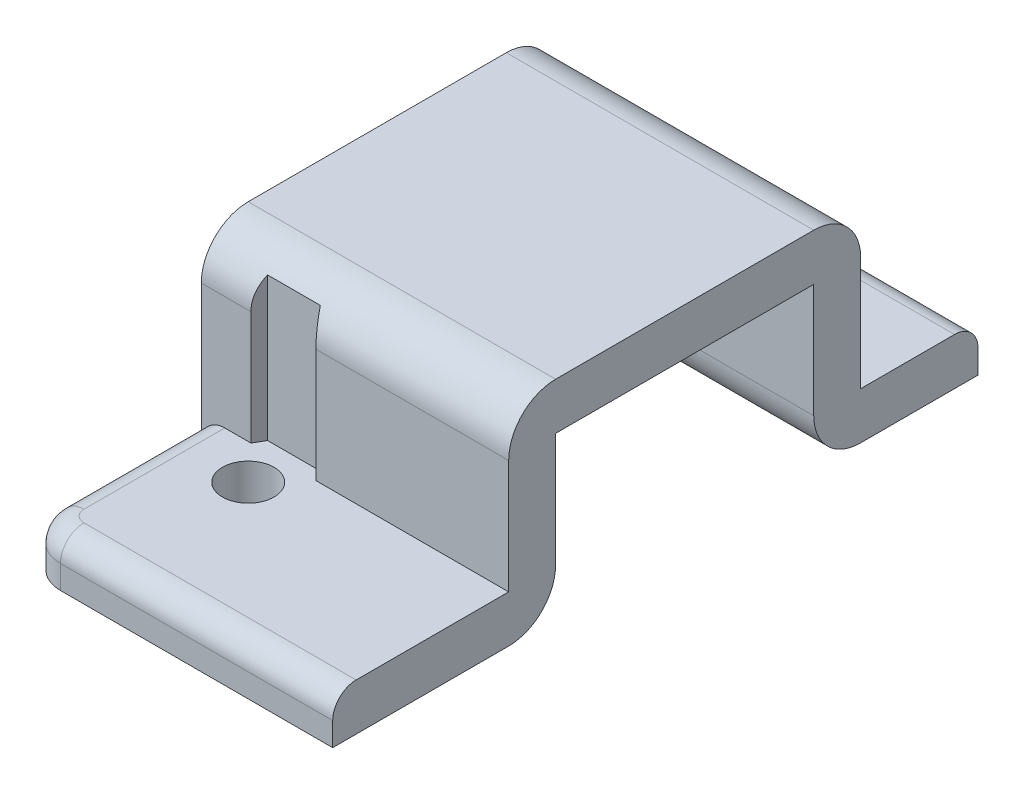
ISO-10303-21;
HEADER;
FILE_DESCRIPTION(('STEP AP214'),'2;1');
FILE_NAME('part.step','',(''),(''),'','','');
FILE_SCHEMA(('AUTOMOTIVE_DESIGN { 1 0 10303 214 1 1 1 1 }'));
ENDSEC;
DATA;
#1=APPLICATION_CONTEXT('core data for automotive mechanical design processes');
#2=APPLICATION_PROTOCOL_DEFINITION('international standard','automotive_design',2000,#1);
#3=PRODUCT_CONTEXT('',#1,'mechanical');
#4=PRODUCT('Part','Part','',(#3));
#5=PRODUCT_RELATED_PRODUCT_CATEGORY('part','',(#4));
#6=PRODUCT_DEFINITION_FORMATION('','',#4);
#7=PRODUCT_DEFINITION_CONTEXT('part definition',#1,'design');
#8=PRODUCT_DEFINITION('design','',#6,#7);
#9=PRODUCT_DEFINITION_SHAPE('','',#8);
#10=(LENGTH_UNIT() NAMED_UNIT(*) SI_UNIT(.MILLI.,.METRE.));
#11=(NAMED_UNIT(*) PLANE_ANGLE_UNIT() SI_UNIT($,.RADIAN.));
#12=(NAMED_UNIT(*) SI_UNIT($,.STERADIAN.) SOLID_ANGLE_UNIT());
#13=UNCERTAINTY_MEASURE_WITH_UNIT(LENGTH_MEASURE(1.E-05),#10,'distance_accuracy_value','');
#14=(GEOMETRIC_REPRESENTATION_CONTEXT(3) GLOBAL_UNCERTAINTY_ASSIGNED_CONTEXT((#13)) GLOBAL_UNIT_ASSIGNED_CONTEXT((#10,
#11,#12)) REPRESENTATION_CONTEXT('',''));
#15=CARTESIAN_POINT('',(0.,0.,0.));
#16=DIRECTION('',(0.,0.,1.));
#17=DIRECTION('',(1.,0.,0.));
#18=AXIS2_PLACEMENT_3D('',#15,#16,#17);
#19=CARTESIAN_POINT('',(6.55,0.,-7.5));
#20=DIRECTION('',(0.,0.,1.));
#21=DIRECTION('',(0.,-1.,0.));
#22=AXIS2_PLACEMENT_3D('',#19,#20,#21);
#23=PLANE('',#22);
#24=DIRECTION('',(0.,1.,0.));
#25=VECTOR('',#24,1.);
#26=CARTESIAN_POINT('',(-6.55,0.,-7.5));
#27=LINE('',#26,#25);
#28=CARTESIAN_POINT('',(-6.55,1.,-7.5));
#29=VERTEX_POINT('',#28);
#30=CARTESIAN_POINT('',(-6.55,6.85,-7.5));
#31=VERTEX_POINT('',#30);
#32=EDGE_CURVE('E427',#29,#31,#27,.T.);
#33=ORIENTED_EDGE('',*,*,#32,.T.);
#34=DIRECTION('',(1.,0.,0.));
#35=VECTOR('',#34,1.);
#36=CARTESIAN_POINT('',(-5.49198729810778,6.85,-7.5));
#37=LINE('',#36,#35);
#38=CARTESIAN_POINT('',(-4.43397459621556,6.85,-7.5));
#39=VERTEX_POINT('',#38);
#40=EDGE_CURVE('E259',#31,#39,#37,.T.);
#41=ORIENTED_EDGE('',*,*,#40,.T.);
#42=DIRECTION('',(0.,1.,0.));
#43=VECTOR('',#42,1.);
#44=CARTESIAN_POINT('',(-4.43397459621556,8.851,-7.5));
#45=LINE('',#44,#43);
#46=CARTESIAN_POINT('',(-4.43397459621556,2.,-7.5));
#47=VERTEX_POINT('',#46);
#48=EDGE_CURVE('E243',#47,#39,#45,.T.);
#49=ORIENTED_EDGE('',*,*,#48,.F.);
#50=DIRECTION('',(-1.,0.,0.));
#51=VECTOR('',#50,1.);
#52=CARTESIAN_POINT('',(6.55,2.,-7.5));
#53=LINE('',#52,#51);
#54=CARTESIAN_POINT('',(-5.55,2.,-7.5));
#55=VERTEX_POINT('',#54);
#56=EDGE_CURVE('E256',#47,#55,#53,.T.);
#57=ORIENTED_EDGE('',*,*,#56,.T.);
#58=CARTESIAN_POINT('',(-5.55,1.,-7.5));
#59=DIRECTION('',(0.,0.,1.));
#60=DIRECTION('',(0.,-1.,0.));
#61=AXIS2_PLACEMENT_3D('',#58,#59,#60);
#62=CIRCLE('',#61,1.);
#63=EDGE_CURVE('E11',#55,#29,#62,.T.);
#64=ORIENTED_EDGE('',*,*,#63,.T.);
#65=EDGE_LOOP('',(#33,#41,#49,#57,#64));
#66=FACE_BOUND('',#65,.T.);
#67=ADVANCED_FACE('F38',(#66),#23,.F.);
#68=CARTESIAN_POINT('',(6.55,8.85,0.));
#69=DIRECTION('',(0.,1.,0.));
#70=DIRECTION('',(0.,0.,1.));
#71=AXIS2_PLACEMENT_3D('',#68,#69,#70);
#72=PLANE('',#71);
#73=DIRECTION('',(0.,0.,-1.));
#74=VECTOR('',#73,1.);
#75=CARTESIAN_POINT('',(-6.55,8.85,0.));
#76=LINE('',#75,#74);
#77=CARTESIAN_POINT('',(-6.55,8.85,5.5));
#78=VERTEX_POINT('',#77);
#79=CARTESIAN_POINT('',(-6.55,8.85,-5.5));
#80=VERTEX_POINT('',#79);
#81=EDGE_CURVE('E429',#78,#80,#76,.T.);
#82=ORIENTED_EDGE('',*,*,#81,.F.);
#83=DIRECTION('',(-1.,0.,0.));
#84=VECTOR('',#83,1.);
#85=CARTESIAN_POINT('',(6.55,8.85,5.5));
#86=LINE('',#85,#84);
#87=CARTESIAN_POINT('',(6.55,8.85,5.5));
#88=VERTEX_POINT('',#87);
#89=EDGE_CURVE('E314',#78,#88,#86,.F.);
#90=ORIENTED_EDGE('',*,*,#89,.T.);
#91=DIRECTION('',(0.,0.,-1.));
#92=VECTOR('',#91,1.);
#93=CARTESIAN_POINT('',(6.55,8.85,0.));
#94=LINE('',#93,#92);
#95=CARTESIAN_POINT('',(6.55,8.85,-5.5));
#96=VERTEX_POINT('',#95);
#97=EDGE_CURVE('E396',#88,#96,#94,.T.);
#98=ORIENTED_EDGE('',*,*,#97,.T.);
#99=DIRECTION('',(-1.,0.,0.));
#100=VECTOR('',#99,1.);
#101=CARTESIAN_POINT('',(-1.66602540378444,8.85,-5.5));
#102=LINE('',#101,#100);
#103=EDGE_CURVE('E311',#96,#80,#102,.T.);
#104=ORIENTED_EDGE('',*,*,#103,.T.);
#105=EDGE_LOOP('',(#82,#90,#98,#104));
#106=FACE_BOUND('',#105,.T.);
#107=ADVANCED_FACE('F586',(#106),#72,.T.);
#108=CARTESIAN_POINT('',(6.55,0.,7.5));
#109=DIRECTION('',(0.,0.,1.));
#110=DIRECTION('',(0.,-1.,0.));
#111=AXIS2_PLACEMENT_3D('',#108,#109,#110);
#112=PLANE('',#111);
#113=DIRECTION('',(0.,-1.,0.));
#114=VECTOR('',#113,1.);
#115=CARTESIAN_POINT('',(-4.43397459621556,8.851,7.5));
#116=LINE('',#115,#114);
#117=CARTESIAN_POINT('',(-4.43397459621556,6.85,7.5));
#118=VERTEX_POINT('',#117);
#119=CARTESIAN_POINT('',(-4.43397459621556,2.,7.5));
#120=VERTEX_POINT('',#119);
#121=EDGE_CURVE('E554',#118,#120,#116,.T.);
#122=ORIENTED_EDGE('',*,*,#121,.F.);
#123=DIRECTION('',(-1.,0.,0.));
#124=VECTOR('',#123,1.);
#125=CARTESIAN_POINT('',(-5.49198729810778,6.85,7.5));
#126=LINE('',#125,#124);
#127=CARTESIAN_POINT('',(-6.55,6.85,7.5));
#128=VERTEX_POINT('',#127);
#129=EDGE_CURVE('E309',#118,#128,#126,.T.);
#130=ORIENTED_EDGE('',*,*,#129,.T.);
#131=DIRECTION('',(0.,1.,0.));
#132=VECTOR('',#131,1.);
#133=CARTESIAN_POINT('',(-6.55,0.,7.5));
#134=LINE('',#133,#132);
#135=CARTESIAN_POINT('',(-6.55,1.,7.5));
#136=VERTEX_POINT('',#135);
#137=EDGE_CURVE('E433',#136,#128,#134,.T.);
#138=ORIENTED_EDGE('',*,*,#137,.F.);
#139=CARTESIAN_POINT('',(-5.55,1.,7.5));
#140=DIRECTION('',(0.,0.,1.));
#141=DIRECTION('',(0.,-1.,0.));
#142=AXIS2_PLACEMENT_3D('',#139,#140,#141);
#143=CIRCLE('',#142,1.);
#144=CARTESIAN_POINT('',(-5.55,2.,7.5));
#145=VERTEX_POINT('',#144);
#146=EDGE_CURVE('E47',#136,#145,#143,.F.);
#147=ORIENTED_EDGE('',*,*,#146,.T.);
#148=DIRECTION('',(-1.,0.,0.));
#149=VECTOR('',#148,1.);
#150=CARTESIAN_POINT('',(6.55,2.,7.5));
#151=LINE('',#150,#149);
#152=EDGE_CURVE('E271',#120,#145,#151,.T.);
#153=ORIENTED_EDGE('',*,*,#152,.F.);
#154=EDGE_LOOP('',(#122,#130,#138,#147,#153));
#155=FACE_BOUND('',#154,.T.);
#156=ADVANCED_FACE('F592',(#155),#112,.T.);
#157=DIRECTION('',(0.,1.,0.));
#158=VECTOR('',#157,1.);
#159=CARTESIAN_POINT('',(6.55,0.,7.5));
#160=LINE('',#159,#158);
#161=CARTESIAN_POINT('',(6.55,2.,7.5));
#162=VERTEX_POINT('',#161);
#163=CARTESIAN_POINT('',(6.55,6.85,7.5));
#164=VERTEX_POINT('',#163);
#165=EDGE_CURVE('E407',#162,#164,#160,.T.);
#166=ORIENTED_EDGE('',*,*,#165,.T.);
#167=DIRECTION('',(-1.,0.,0.));
#168=VECTOR('',#167,1.);
#169=CARTESIAN_POINT('',(6.55,6.85,7.5));
#170=LINE('',#169,#168);
#171=CARTESIAN_POINT('',(-1.66602540378444,6.85,7.5));
#172=VERTEX_POINT('',#171);
#173=EDGE_CURVE('E300',#164,#172,#170,.T.);
#174=ORIENTED_EDGE('',*,*,#173,.T.);
#175=DIRECTION('',(0.,1.,0.));
#176=VECTOR('',#175,1.);
#177=CARTESIAN_POINT('',(-1.66602540378444,8.851,7.5));
#178=LINE('',#177,#176);
#179=CARTESIAN_POINT('',(-1.66602540378444,2.,7.5));
#180=VERTEX_POINT('',#179);
#181=EDGE_CURVE('E550',#180,#172,#178,.T.);
#182=ORIENTED_EDGE('',*,*,#181,.F.);
#183=EDGE_CURVE('E266',#162,#180,#151,.T.);
#184=ORIENTED_EDGE('',*,*,#183,.F.);
#185=EDGE_LOOP('',(#166,#174,#182,#184));
#186=FACE_BOUND('',#185,.T.);
#187=ADVANCED_FACE('F604',(#186),#112,.T.);
#188=CARTESIAN_POINT('',(6.55,2.,0.));
#189=DIRECTION('',(0.,1.,0.));
#190=DIRECTION('',(0.,0.,1.));
#191=AXIS2_PLACEMENT_3D('',#188,#189,#190);
#192=PLANE('',#191);
#193=CARTESIAN_POINT('',(-3.05,2.,-9.));
#194=DIRECTION('',(0.,-1.,0.));
#195=DIRECTION('',(0.,0.,-1.));
#196=AXIS2_PLACEMENT_3D('',#193,#194,#195);
#197=CIRCLE('',#196,1.1);
#198=CARTESIAN_POINT('',(-3.05,2.,-10.1));
#199=VERTEX_POINT('',#198);
#200=EDGE_CURVE('E543',#199,#199,#197,.T.);
#201=ORIENTED_EDGE('',*,*,#200,.T.);
#202=EDGE_LOOP('',(#201));
#203=FACE_BOUND('',#202,.T.);
#204=CARTESIAN_POINT('',(-5.05,2.,-11.));
#205=DIRECTION('',(0.,1.,0.));
#206=DIRECTION('',(0.,0.,1.));
#207=AXIS2_PLACEMENT_3D('',#204,#205,#206);
#208=CIRCLE('',#207,0.5);
#209=CARTESIAN_POINT('',(-5.05,2.,-11.5));
#210=VERTEX_POINT('',#209);
#211=CARTESIAN_POINT('',(-5.55,2.,-11.));
#212=VERTEX_POINT('',#211);
#213=EDGE_CURVE('E355',#210,#212,#208,.T.);
#214=ORIENTED_EDGE('',*,*,#213,.T.);
#215=DIRECTION('',(0.,0.,-1.));
#216=VECTOR('',#215,1.);
#217=CARTESIAN_POINT('',(-5.55,2.,-7.5));
#218=LINE('',#217,#216);
#219=EDGE_CURVE('E264',#212,#55,#218,.F.);
#220=ORIENTED_EDGE('',*,*,#219,.T.);
#221=ORIENTED_EDGE('',*,*,#56,.F.);
#222=DIRECTION('',(-0.5,0.,-0.866025403784439));
#223=VECTOR('',#222,1.);
#224=CARTESIAN_POINT('',(-4.175,2.,-7.05144284148501));
#225=LINE('',#224,#223);
#226=CARTESIAN_POINT('',(-4.175,2.,-7.05144284148501));
#227=VERTEX_POINT('',#226);
#228=EDGE_CURVE('E240',#227,#47,#225,.T.);
#229=ORIENTED_EDGE('',*,*,#228,.F.);
#230=DIRECTION('',(-1.,0.,0.));
#231=VECTOR('',#230,1.);
#232=CARTESIAN_POINT('',(-1.925,2.,-7.05144284148501));
#233=LINE('',#232,#231);
#234=CARTESIAN_POINT('',(-1.925,2.,-7.05144284148501));
#235=VERTEX_POINT('',#234);
#236=EDGE_CURVE('E251',#235,#227,#233,.T.);
#237=ORIENTED_EDGE('',*,*,#236,.F.);
#238=DIRECTION('',(-0.5,0.,0.866025403784439));
#239=VECTOR('',#238,1.);
#240=CARTESIAN_POINT('',(-0.8,2.,-9.));
#241=LINE('',#240,#239);
#242=CARTESIAN_POINT('',(-1.66602540378444,2.,-7.5));
#243=VERTEX_POINT('',#242);
#244=EDGE_CURVE('E545',#243,#235,#241,.T.);
#245=ORIENTED_EDGE('',*,*,#244,.F.);
#246=CARTESIAN_POINT('',(6.55,2.,-7.5));
#247=VERTEX_POINT('',#246);
#248=EDGE_CURVE('E265',#247,#243,#53,.T.);
#249=ORIENTED_EDGE('',*,*,#248,.F.);
#250=DIRECTION('',(0.,0.,-1.));
#251=VECTOR('',#250,1.);
#252=CARTESIAN_POINT('',(6.55,2.,0.));
#253=LINE('',#252,#251);
#254=CARTESIAN_POINT('',(6.55,2.,-11.5));
#255=VERTEX_POINT('',#254);
#256=EDGE_CURVE('E388',#247,#255,#253,.T.);
#257=ORIENTED_EDGE('',*,*,#256,.T.);
#258=DIRECTION('',(-1.,0.,0.));
#259=VECTOR('',#258,1.);
#260=CARTESIAN_POINT('',(6.55,2.,-11.5));
#261=LINE('',#260,#259);
#262=EDGE_CURVE('E353',#255,#210,#261,.T.);
#263=ORIENTED_EDGE('',*,*,#262,.T.);
#264=EDGE_LOOP('',(#214,#220,#221,#229,#237,#245,#249,#257,#263));
#265=FACE_BOUND('',#264,.T.);
#266=ADVANCED_FACE('F262',(#203,#265),#192,.T.);
#267=DIRECTION('',(0.,-1.,0.));
#268=VECTOR('',#267,1.);
#269=CARTESIAN_POINT('',(-1.66602540378444,8.851,-7.5));
#270=LINE('',#269,#268);
#271=CARTESIAN_POINT('',(-1.66602540378444,6.85,-7.5));
#272=VERTEX_POINT('',#271);
#273=EDGE_CURVE('E260',#272,#243,#270,.T.);
#274=ORIENTED_EDGE('',*,*,#273,.F.);
#275=DIRECTION('',(-1.,0.,0.));
#276=VECTOR('',#275,1.);
#277=CARTESIAN_POINT('',(6.55,6.85,-7.5));
#278=LINE('',#277,#276);
#279=CARTESIAN_POINT('',(6.55,6.85,-7.5));
#280=VERTEX_POINT('',#279);
#281=EDGE_CURVE('E323',#272,#280,#278,.F.);
#282=ORIENTED_EDGE('',*,*,#281,.T.);
#283=DIRECTION('',(0.,1.,0.));
#284=VECTOR('',#283,1.);
#285=CARTESIAN_POINT('',(6.55,0.,-7.5));
#286=LINE('',#285,#284);
#287=EDGE_CURVE('E393',#247,#280,#286,.T.);
#288=ORIENTED_EDGE('',*,*,#287,.F.);
#289=ORIENTED_EDGE('',*,*,#248,.T.);
#290=EDGE_LOOP('',(#274,#282,#288,#289));
#291=FACE_BOUND('',#290,.T.);
#292=ADVANCED_FACE('F588',(#291),#23,.F.);
#293=CARTESIAN_POINT('',(6.55,2.,0.));
#294=DIRECTION('',(0.,-1.,0.));
#295=DIRECTION('',(0.,0.,-1.));
#296=AXIS2_PLACEMENT_3D('',#293,#294,#295);
#297=PLANE('',#296);
#298=CARTESIAN_POINT('',(-3.05,2.,9.));
#299=DIRECTION('',(0.,1.,0.));
#300=DIRECTION('',(0.,0.,1.));
#301=AXIS2_PLACEMENT_3D('',#298,#299,#300);
#302=CIRCLE('',#301,1.1);
#303=CARTESIAN_POINT('',(-3.05,2.,10.1));
#304=VERTEX_POINT('',#303);
#305=EDGE_CURVE('E430',#304,#304,#302,.T.);
#306=ORIENTED_EDGE('',*,*,#305,.F.);
#307=EDGE_LOOP('',(#306));
#308=FACE_BOUND('',#307,.T.);
#309=ORIENTED_EDGE('',*,*,#152,.T.);
#310=DIRECTION('',(0.,0.,1.));
#311=VECTOR('',#310,1.);
#312=CARTESIAN_POINT('',(-5.55,2.,0.));
#313=LINE('',#312,#311);
#314=CARTESIAN_POINT('',(-5.55,2.,13.5));
#315=VERTEX_POINT('',#314);
#316=EDGE_CURVE('E342',#145,#315,#313,.T.);
#317=ORIENTED_EDGE('',*,*,#316,.T.);
#318=CARTESIAN_POINT('',(-5.05,2.,13.5));
#319=DIRECTION('',(0.,-1.,0.));
#320=DIRECTION('',(0.,0.,-1.));
#321=AXIS2_PLACEMENT_3D('',#318,#319,#320);
#322=CIRCLE('',#321,0.5);
#323=CARTESIAN_POINT('',(-5.05,2.,14.));
#324=VERTEX_POINT('',#323);
#325=EDGE_CURVE('E340',#315,#324,#322,.F.);
#326=ORIENTED_EDGE('',*,*,#325,.T.);
#327=DIRECTION('',(-1.,0.,0.));
#328=VECTOR('',#327,1.);
#329=CARTESIAN_POINT('',(6.55,2.,14.));
#330=LINE('',#329,#328);
#331=CARTESIAN_POINT('',(6.55,2.,14.));
#332=VERTEX_POINT('',#331);
#333=EDGE_CURVE('E338',#324,#332,#330,.F.);
#334=ORIENTED_EDGE('',*,*,#333,.T.);
#335=DIRECTION('',(0.,0.,1.));
#336=VECTOR('',#335,1.);
#337=CARTESIAN_POINT('',(6.55,2.,0.));
#338=LINE('',#337,#336);
#339=EDGE_CURVE('E410',#162,#332,#338,.T.);
#340=ORIENTED_EDGE('',*,*,#339,.F.);
#341=ORIENTED_EDGE('',*,*,#183,.T.);
#342=DIRECTION('',(-0.5,0.,-0.866025403784439));
#343=VECTOR('',#342,1.);
#344=CARTESIAN_POINT('',(-0.8,2.,9.));
#345=LINE('',#344,#343);
#346=CARTESIAN_POINT('',(-1.925,2.,7.05144284148501));
#347=VERTEX_POINT('',#346);
#348=EDGE_CURVE('E557',#180,#347,#345,.T.);
#349=ORIENTED_EDGE('',*,*,#348,.T.);
#350=DIRECTION('',(-1.,0.,0.));
#351=VECTOR('',#350,1.);
#352=CARTESIAN_POINT('',(-1.925,2.,7.05144284148501));
#353=LINE('',#352,#351);
#354=CARTESIAN_POINT('',(-4.175,2.,7.05144284148501));
#355=VERTEX_POINT('',#354);
#356=EDGE_CURVE('E560',#347,#355,#353,.T.);
#357=ORIENTED_EDGE('',*,*,#356,.T.);
#358=DIRECTION('',(-0.5,0.,0.866025403784439));
#359=VECTOR('',#358,1.);
#360=CARTESIAN_POINT('',(-4.175,2.,7.05144284148501));
#361=LINE('',#360,#359);
#362=EDGE_CURVE('E465',#355,#120,#361,.T.);
#363=ORIENTED_EDGE('',*,*,#362,.T.);
#364=EDGE_LOOP('',(#309,#317,#326,#334,#340,#341,#349,#357,#363));
#365=FACE_BOUND('',#364,.T.);
#366=ADVANCED_FACE('F462',(#308,#365),#297,.F.);
#367=CARTESIAN_POINT('',(6.55,0.,15.));
#368=DIRECTION('',(0.,0.,1.));
#369=DIRECTION('',(1.,0.,0.));
#370=AXIS2_PLACEMENT_3D('',#367,#368,#369);
#371=PLANE('',#370);
#372=DIRECTION('',(0.,1.,0.));
#373=VECTOR('',#372,1.);
#374=CARTESIAN_POINT('',(6.55,0.,15.));
#375=LINE('',#374,#373);
#376=CARTESIAN_POINT('',(6.55,0.,15.));
#377=VERTEX_POINT('',#376);
#378=CARTESIAN_POINT('',(6.55,0.999999999999999,15.));
#379=VERTEX_POINT('',#378);
#380=EDGE_CURVE('E412',#377,#379,#375,.T.);
#381=ORIENTED_EDGE('',*,*,#380,.T.);
#382=DIRECTION('',(-1.,0.,0.));
#383=VECTOR('',#382,1.);
#384=CARTESIAN_POINT('',(-5.05,0.999999999999999,15.));
#385=LINE('',#384,#383);
#386=CARTESIAN_POINT('',(-5.05,0.999999999999999,15.));
#387=VERTEX_POINT('',#386);
#388=EDGE_CURVE('E360',#379,#387,#385,.T.);
#389=ORIENTED_EDGE('',*,*,#388,.T.);
#390=DIRECTION('',(0.,1.,0.));
#391=VECTOR('',#390,1.);
#392=CARTESIAN_POINT('',(-5.05,0.,15.));
#393=LINE('',#392,#391);
#394=CARTESIAN_POINT('',(-5.05,0.,15.));
#395=VERTEX_POINT('',#394);
#396=EDGE_CURVE('E330',#387,#395,#393,.F.);
#397=ORIENTED_EDGE('',*,*,#396,.T.);
#398=DIRECTION('',(-1.,0.,0.));
#399=VECTOR('',#398,1.);
#400=CARTESIAN_POINT('',(6.55,0.,15.));
#401=LINE('',#400,#399);
#402=EDGE_CURVE('E452',#377,#395,#401,.T.);
#403=ORIENTED_EDGE('',*,*,#402,.F.);
#404=EDGE_LOOP('',(#381,#389,#397,#403));
#405=FACE_BOUND('',#404,.T.);
#406=ADVANCED_FACE('F485',(#405),#371,.T.);
#407=CARTESIAN_POINT('',(6.55,0.,0.));
#408=DIRECTION('',(0.,-1.,0.));
#409=DIRECTION('',(0.,0.,-1.));
#410=AXIS2_PLACEMENT_3D('',#407,#408,#409);
#411=PLANE('',#410);
#412=CARTESIAN_POINT('',(-3.05,0.,9.));
#413=DIRECTION('',(0.,-1.,0.));
#414=DIRECTION('',(0.,0.,-1.));
#415=AXIS2_PLACEMENT_3D('',#412,#413,#414);
#416=CIRCLE('',#415,1.1);
#417=CARTESIAN_POINT('',(-3.05,0.,7.9));
#418=VERTEX_POINT('',#417);
#419=EDGE_CURVE('E402',#418,#418,#416,.F.);
#420=ORIENTED_EDGE('',*,*,#419,.T.);
#421=EDGE_LOOP('',(#420));
#422=FACE_BOUND('',#421,.T.);
#423=ORIENTED_EDGE('',*,*,#402,.T.);
#424=CARTESIAN_POINT('',(-5.05,0.,13.5));
#425=DIRECTION('',(0.,-1.,0.));
#426=DIRECTION('',(0.,0.,-1.));
#427=AXIS2_PLACEMENT_3D('',#424,#425,#426);
#428=CIRCLE('',#427,1.5);
#429=CARTESIAN_POINT('',(-6.55,0.,13.5));
#430=VERTEX_POINT('',#429);
#431=EDGE_CURVE('E332',#395,#430,#428,.T.);
#432=ORIENTED_EDGE('',*,*,#431,.T.);
#433=DIRECTION('',(0.,0.,1.));
#434=VECTOR('',#433,1.);
#435=CARTESIAN_POINT('',(-6.55,0.,0.));
#436=LINE('',#435,#434);
#437=CARTESIAN_POINT('',(-6.55,0.,7.5));
#438=VERTEX_POINT('',#437);
#439=EDGE_CURVE('E436',#438,#430,#436,.T.);
#440=ORIENTED_EDGE('',*,*,#439,.F.);
#441=DIRECTION('',(-1.,0.,0.));
#442=VECTOR('',#441,1.);
#443=CARTESIAN_POINT('',(6.55,0.,7.5));
#444=LINE('',#443,#442);
#445=CARTESIAN_POINT('',(6.55,0.,7.5));
#446=VERTEX_POINT('',#445);
#447=EDGE_CURVE('E298',#438,#446,#444,.F.);
#448=ORIENTED_EDGE('',*,*,#447,.T.);
#449=DIRECTION('',(0.,0.,1.));
#450=VECTOR('',#449,1.);
#451=CARTESIAN_POINT('',(6.55,0.,0.));
#452=LINE('',#451,#450);
#453=EDGE_CURVE('E414',#446,#377,#452,.T.);
#454=ORIENTED_EDGE('',*,*,#453,.T.);
#455=EDGE_LOOP('',(#423,#432,#440,#448,#454));
#456=FACE_BOUND('',#455,.T.);
#457=ADVANCED_FACE('F490',(#422,#456),#411,.T.);
#458=CARTESIAN_POINT('',(6.55,0.,5.5));
#459=DIRECTION('',(0.,0.,1.));
#460=DIRECTION('',(0.,-1.,0.));
#461=AXIS2_PLACEMENT_3D('',#458,#459,#460);
#462=PLANE('',#461);
#463=DIRECTION('',(0.,1.,0.));
#464=VECTOR('',#463,1.);
#465=CARTESIAN_POINT('',(6.55,0.,5.5));
#466=LINE('',#465,#464);
#467=CARTESIAN_POINT('',(6.55,2.,5.5));
#468=VERTEX_POINT('',#467);
#469=CARTESIAN_POINT('',(6.55,6.85,5.5));
#470=VERTEX_POINT('',#469);
#471=EDGE_CURVE('E416',#468,#470,#466,.T.);
#472=ORIENTED_EDGE('',*,*,#471,.F.);
#473=DIRECTION('',(-1.,0.,0.));
#474=VECTOR('',#473,1.);
#475=CARTESIAN_POINT('',(-6.55,2.,5.5));
#476=LINE('',#475,#474);
#477=CARTESIAN_POINT('',(-6.55,2.,5.5));
#478=VERTEX_POINT('',#477);
#479=EDGE_CURVE('E295',#468,#478,#476,.T.);
#480=ORIENTED_EDGE('',*,*,#479,.T.);
#481=DIRECTION('',(0.,1.,0.));
#482=VECTOR('',#481,1.);
#483=CARTESIAN_POINT('',(-6.55,0.,5.5));
#484=LINE('',#483,#482);
#485=CARTESIAN_POINT('',(-6.55,6.85,5.5));
#486=VERTEX_POINT('',#485);
#487=EDGE_CURVE('E439',#478,#486,#484,.T.);
#488=ORIENTED_EDGE('',*,*,#487,.T.);
#489=DIRECTION('',(-1.,0.,0.));
#490=VECTOR('',#489,1.);
#491=CARTESIAN_POINT('',(6.55,6.85,5.5));
#492=LINE('',#491,#490);
#493=EDGE_CURVE('E450',#470,#486,#492,.T.);
#494=ORIENTED_EDGE('',*,*,#493,.F.);
#495=EDGE_LOOP('',(#472,#480,#488,#494));
#496=FACE_BOUND('',#495,.T.);
#497=ADVANCED_FACE('F502',(#496),#462,.F.);
#498=CARTESIAN_POINT('',(6.55,6.85,0.));
#499=DIRECTION('',(0.,1.,0.));
#500=DIRECTION('',(0.,0.,1.));
#501=AXIS2_PLACEMENT_3D('',#498,#499,#500);
#502=PLANE('',#501);
#503=DIRECTION('',(0.,0.,-1.));
#504=VECTOR('',#503,1.);
#505=CARTESIAN_POINT('',(-6.55,6.85,0.));
#506=LINE('',#505,#504);
#507=CARTESIAN_POINT('',(-6.55,6.85,-5.5));
#508=VERTEX_POINT('',#507);
#509=EDGE_CURVE('E441',#486,#508,#506,.T.);
#510=ORIENTED_EDGE('',*,*,#509,.T.);
#511=DIRECTION('',(-1.,0.,0.));
#512=VECTOR('',#511,1.);
#513=CARTESIAN_POINT('',(6.55,6.85,-5.5));
#514=LINE('',#513,#512);
#515=CARTESIAN_POINT('',(6.55,6.85,-5.5));
#516=VERTEX_POINT('',#515);
#517=EDGE_CURVE('E447',#516,#508,#514,.T.);
#518=ORIENTED_EDGE('',*,*,#517,.F.);
#519=DIRECTION('',(0.,0.,-1.));
#520=VECTOR('',#519,1.);
#521=CARTESIAN_POINT('',(6.55,6.85,0.));
#522=LINE('',#521,#520);
#523=EDGE_CURVE('E418',#470,#516,#522,.T.);
#524=ORIENTED_EDGE('',*,*,#523,.F.);
#525=ORIENTED_EDGE('',*,*,#493,.T.);
#526=EDGE_LOOP('',(#510,#518,#524,#525));
#527=FACE_BOUND('',#526,.T.);
#528=ADVANCED_FACE('F510',(#527),#502,.F.);
#529=CARTESIAN_POINT('',(6.55,0.,-5.5));
#530=DIRECTION('',(0.,0.,-1.));
#531=DIRECTION('',(0.,1.,0.));
#532=AXIS2_PLACEMENT_3D('',#529,#530,#531);
#533=PLANE('',#532);
#534=DIRECTION('',(0.,-1.,0.));
#535=VECTOR('',#534,1.);
#536=CARTESIAN_POINT('',(-6.55,0.,-5.5));
#537=LINE('',#536,#535);
#538=CARTESIAN_POINT('',(-6.55,2.,-5.5));
#539=VERTEX_POINT('',#538);
#540=EDGE_CURVE('E399',#508,#539,#537,.T.);
#541=ORIENTED_EDGE('',*,*,#540,.T.);
#542=DIRECTION('',(-1.,0.,0.));
#543=VECTOR('',#542,1.);
#544=CARTESIAN_POINT('',(6.55,2.,-5.5));
#545=LINE('',#544,#543);
#546=CARTESIAN_POINT('',(6.55,2.,-5.5));
#547=VERTEX_POINT('',#546);
#548=EDGE_CURVE('E285',#539,#547,#545,.F.);
#549=ORIENTED_EDGE('',*,*,#548,.T.);
#550=DIRECTION('',(0.,-1.,0.));
#551=VECTOR('',#550,1.);
#552=CARTESIAN_POINT('',(6.55,0.,-5.5));
#553=LINE('',#552,#551);
#554=EDGE_CURVE('E420',#516,#547,#553,.T.);
#555=ORIENTED_EDGE('',*,*,#554,.F.);
#556=ORIENTED_EDGE('',*,*,#517,.T.);
#557=EDGE_LOOP('',(#541,#549,#555,#556));
#558=FACE_BOUND('',#557,.T.);
#559=ADVANCED_FACE('F513',(#558),#533,.F.);
#560=CARTESIAN_POINT('',(6.55,0.,0.));
#561=DIRECTION('',(0.,1.,0.));
#562=DIRECTION('',(0.,0.,1.));
#563=AXIS2_PLACEMENT_3D('',#560,#561,#562);
#564=PLANE('',#563);
#565=CARTESIAN_POINT('',(-3.05,0.,-9.));
#566=DIRECTION('',(0.,1.,0.));
#567=DIRECTION('',(0.,0.,1.));
#568=AXIS2_PLACEMENT_3D('',#565,#566,#567);
#569=CIRCLE('',#568,1.1);
#570=CARTESIAN_POINT('',(-3.05,0.,-7.9));
#571=VERTEX_POINT('',#570);
#572=EDGE_CURVE('E539',#571,#571,#569,.T.);
#573=ORIENTED_EDGE('',*,*,#572,.T.);
#574=EDGE_LOOP('',(#573));
#575=FACE_BOUND('',#574,.T.);
#576=DIRECTION('',(0.,0.,-1.));
#577=VECTOR('',#576,1.);
#578=CARTESIAN_POINT('',(-6.55,0.,0.));
#579=LINE('',#578,#577);
#580=CARTESIAN_POINT('',(-6.55,0.,-7.5));
#581=VERTEX_POINT('',#580);
#582=CARTESIAN_POINT('',(-6.55,0.,-11.));
#583=VERTEX_POINT('',#582);
#584=EDGE_CURVE('E394',#581,#583,#579,.T.);
#585=ORIENTED_EDGE('',*,*,#584,.T.);
#586=CARTESIAN_POINT('',(-5.05,0.,-11.));
#587=DIRECTION('',(0.,1.,0.));
#588=DIRECTION('',(0.,0.,1.));
#589=AXIS2_PLACEMENT_3D('',#586,#587,#588);
#590=CIRCLE('',#589,1.5);
#591=CARTESIAN_POINT('',(-5.05,0.,-12.5));
#592=VERTEX_POINT('',#591);
#593=EDGE_CURVE('E334',#583,#592,#590,.F.);
#594=ORIENTED_EDGE('',*,*,#593,.T.);
#595=DIRECTION('',(-1.,0.,0.));
#596=VECTOR('',#595,1.);
#597=CARTESIAN_POINT('',(6.55,0.,-12.5));
#598=LINE('',#597,#596);
#599=CARTESIAN_POINT('',(6.55,0.,-12.5));
#600=VERTEX_POINT('',#599);
#601=EDGE_CURVE('E426',#600,#592,#598,.T.);
#602=ORIENTED_EDGE('',*,*,#601,.F.);
#603=DIRECTION('',(0.,0.,-1.));
#604=VECTOR('',#603,1.);
#605=CARTESIAN_POINT('',(6.55,0.,0.));
#606=LINE('',#605,#604);
#607=CARTESIAN_POINT('',(6.55,0.,-7.5));
#608=VERTEX_POINT('',#607);
#609=EDGE_CURVE('E423',#608,#600,#606,.T.);
#610=ORIENTED_EDGE('',*,*,#609,.F.);
#611=DIRECTION('',(-1.,0.,0.));
#612=VECTOR('',#611,1.);
#613=CARTESIAN_POINT('',(6.55,0.,-7.5));
#614=LINE('',#613,#612);
#615=EDGE_CURVE('E269',#608,#581,#614,.T.);
#616=ORIENTED_EDGE('',*,*,#615,.T.);
#617=EDGE_LOOP('',(#585,#594,#602,#610,#616));
#618=FACE_BOUND('',#617,.T.);
#619=ADVANCED_FACE('F521',(#575,#618),#564,.F.);
#620=CARTESIAN_POINT('',(6.55,0.,-12.5));
#621=DIRECTION('',(0.,0.,-1.));
#622=DIRECTION('',(-1.,0.,0.));
#623=AXIS2_PLACEMENT_3D('',#620,#621,#622);
#624=PLANE('',#623);
#625=DIRECTION('',(0.,-1.,0.));
#626=VECTOR('',#625,1.);
#627=CARTESIAN_POINT('',(-5.05,2.,-12.5));
#628=LINE('',#627,#626);
#629=CARTESIAN_POINT('',(-5.05,1.,-12.5));
#630=VERTEX_POINT('',#629);
#631=EDGE_CURVE('E336',#592,#630,#628,.F.);
#632=ORIENTED_EDGE('',*,*,#631,.T.);
#633=DIRECTION('',(-1.,0.,0.));
#634=VECTOR('',#633,1.);
#635=CARTESIAN_POINT('',(6.55,1.,-12.5));
#636=LINE('',#635,#634);
#637=CARTESIAN_POINT('',(6.55,1.,-12.5));
#638=VERTEX_POINT('',#637);
#639=EDGE_CURVE('E55',#630,#638,#636,.F.);
#640=ORIENTED_EDGE('',*,*,#639,.T.);
#641=DIRECTION('',(0.,-1.,0.));
#642=VECTOR('',#641,1.);
#643=CARTESIAN_POINT('',(6.55,0.,-12.5));
#644=LINE('',#643,#642);
#645=EDGE_CURVE('E390',#638,#600,#644,.T.);
#646=ORIENTED_EDGE('',*,*,#645,.T.);
#647=ORIENTED_EDGE('',*,*,#601,.T.);
#648=EDGE_LOOP('',(#632,#640,#646,#647));
#649=FACE_BOUND('',#648,.T.);
#650=ADVANCED_FACE('F525',(#649),#624,.T.);
#651=CARTESIAN_POINT('',(6.55,0.,0.));
#652=DIRECTION('',(1.,0.,0.));
#653=DIRECTION('',(0.,0.,-1.));
#654=AXIS2_PLACEMENT_3D('',#651,#652,#653);
#655=PLANE('',#654);
#656=ORIENTED_EDGE('',*,*,#339,.T.);
#657=CARTESIAN_POINT('',(6.55,0.999999999999999,14.));
#658=DIRECTION('',(1.,0.,0.));
#659=DIRECTION('',(0.,0.,-1.));
#660=AXIS2_PLACEMENT_3D('',#657,#658,#659);
#661=CIRCLE('',#660,1.);
#662=EDGE_CURVE('E63',#332,#379,#661,.T.);
#663=ORIENTED_EDGE('',*,*,#662,.T.);
#664=ORIENTED_EDGE('',*,*,#380,.F.);
#665=ORIENTED_EDGE('',*,*,#453,.F.);
#666=CARTESIAN_POINT('',(6.55,2.,7.5));
#667=DIRECTION('',(1.,0.,0.));
#668=DIRECTION('',(0.,0.,-1.));
#669=AXIS2_PLACEMENT_3D('',#666,#667,#668);
#670=CIRCLE('',#669,2.);
#671=EDGE_CURVE('E291',#446,#468,#670,.T.);
#672=ORIENTED_EDGE('',*,*,#671,.T.);
#673=ORIENTED_EDGE('',*,*,#471,.T.);
#674=ORIENTED_EDGE('',*,*,#523,.T.);
#675=ORIENTED_EDGE('',*,*,#554,.T.);
#676=CARTESIAN_POINT('',(6.55,2.,-7.5));
#677=DIRECTION('',(1.,0.,0.));
#678=DIRECTION('',(0.,0.,-1.));
#679=AXIS2_PLACEMENT_3D('',#676,#677,#678);
#680=CIRCLE('',#679,2.);
#681=EDGE_CURVE('E293',#547,#608,#680,.T.);
#682=ORIENTED_EDGE('',*,*,#681,.T.);
#683=ORIENTED_EDGE('',*,*,#609,.T.);
#684=ORIENTED_EDGE('',*,*,#645,.F.);
#685=CARTESIAN_POINT('',(6.55,1.,-11.5));
#686=DIRECTION('',(1.,0.,0.));
#687=DIRECTION('',(0.,0.,-1.));
#688=AXIS2_PLACEMENT_3D('',#685,#686,#687);
#689=CIRCLE('',#688,1.);
#690=EDGE_CURVE('E362',#638,#255,#689,.T.);
#691=ORIENTED_EDGE('',*,*,#690,.T.);
#692=ORIENTED_EDGE('',*,*,#256,.F.);
#693=ORIENTED_EDGE('',*,*,#287,.T.);
#694=CARTESIAN_POINT('',(6.55,6.85,-5.5));
#695=DIRECTION('',(1.,0.,0.));
#696=DIRECTION('',(0.,0.,-1.));
#697=AXIS2_PLACEMENT_3D('',#694,#695,#696);
#698=CIRCLE('',#697,2.);
#699=EDGE_CURVE('E287',#280,#96,#698,.T.);
#700=ORIENTED_EDGE('',*,*,#699,.T.);
#701=ORIENTED_EDGE('',*,*,#97,.F.);
#702=CARTESIAN_POINT('',(6.55,6.85,5.5));
#703=DIRECTION('',(1.,0.,0.));
#704=DIRECTION('',(0.,0.,-1.));
#705=AXIS2_PLACEMENT_3D('',#702,#703,#704);
#706=CIRCLE('',#705,2.);
#707=EDGE_CURVE('E289',#88,#164,#706,.T.);
#708=ORIENTED_EDGE('',*,*,#707,.T.);
#709=ORIENTED_EDGE('',*,*,#165,.F.);
#710=EDGE_LOOP('',(#656,#663,#664,#665,#672,#673,#674,#675,#682,#683,#684,#691,#692,#693,#700,
#701,#708,#709));
#711=FACE_BOUND('',#710,.T.);
#712=ADVANCED_FACE('F386',(#711),#655,.T.);
#713=CARTESIAN_POINT('',(-6.55,0.,0.));
#714=DIRECTION('',(1.,0.,0.));
#715=DIRECTION('',(0.,0.,-1.));
#716=AXIS2_PLACEMENT_3D('',#713,#714,#715);
#717=PLANE('',#716);
#718=DIRECTION('',(0.,1.,0.));
#719=VECTOR('',#718,1.);
#720=CARTESIAN_POINT('',(-6.55,2.,13.5));
#721=LINE('',#720,#719);
#722=CARTESIAN_POINT('',(-6.55,0.999999999999999,13.5));
#723=VERTEX_POINT('',#722);
#724=EDGE_CURVE('E327',#430,#723,#721,.T.);
#725=ORIENTED_EDGE('',*,*,#724,.T.);
#726=DIRECTION('',(0.,0.,1.));
#727=VECTOR('',#726,1.);
#728=CARTESIAN_POINT('',(-6.55,1.,0.));
#729=LINE('',#728,#727);
#730=EDGE_CURVE('E348',#723,#136,#729,.F.);
#731=ORIENTED_EDGE('',*,*,#730,.T.);
#732=ORIENTED_EDGE('',*,*,#137,.T.);
#733=CARTESIAN_POINT('',(-6.55,6.85,5.5));
#734=DIRECTION('',(1.,0.,0.));
#735=DIRECTION('',(0.,0.,-1.));
#736=AXIS2_PLACEMENT_3D('',#733,#734,#735);
#737=CIRCLE('',#736,2.);
#738=EDGE_CURVE('E279',#128,#78,#737,.F.);
#739=ORIENTED_EDGE('',*,*,#738,.T.);
#740=ORIENTED_EDGE('',*,*,#81,.T.);
#741=CARTESIAN_POINT('',(-6.55,6.85,-5.5));
#742=DIRECTION('',(1.,0.,0.));
#743=DIRECTION('',(0.,0.,-1.));
#744=AXIS2_PLACEMENT_3D('',#741,#742,#743);
#745=CIRCLE('',#744,2.);
#746=EDGE_CURVE('E277',#80,#31,#745,.F.);
#747=ORIENTED_EDGE('',*,*,#746,.T.);
#748=ORIENTED_EDGE('',*,*,#32,.F.);
#749=DIRECTION('',(0.,0.,-1.));
#750=VECTOR('',#749,1.);
#751=CARTESIAN_POINT('',(-6.55,1.,-11.));
#752=LINE('',#751,#750);
#753=CARTESIAN_POINT('',(-6.55,1.,-11.));
#754=VERTEX_POINT('',#753);
#755=EDGE_CURVE('E345',#29,#754,#752,.T.);
#756=ORIENTED_EDGE('',*,*,#755,.T.);
#757=DIRECTION('',(0.,-1.,0.));
#758=VECTOR('',#757,1.);
#759=CARTESIAN_POINT('',(-6.55,0.,-11.));
#760=LINE('',#759,#758);
#761=EDGE_CURVE('E325',#754,#583,#760,.T.);
#762=ORIENTED_EDGE('',*,*,#761,.T.);
#763=ORIENTED_EDGE('',*,*,#584,.F.);
#764=CARTESIAN_POINT('',(-6.55,2.,-7.5));
#765=DIRECTION('',(1.,0.,0.));
#766=DIRECTION('',(0.,0.,-1.));
#767=AXIS2_PLACEMENT_3D('',#764,#765,#766);
#768=CIRCLE('',#767,2.);
#769=EDGE_CURVE('E283',#581,#539,#768,.F.);
#770=ORIENTED_EDGE('',*,*,#769,.T.);
#771=ORIENTED_EDGE('',*,*,#540,.F.);
#772=ORIENTED_EDGE('',*,*,#509,.F.);
#773=ORIENTED_EDGE('',*,*,#487,.F.);
#774=CARTESIAN_POINT('',(-6.55,2.,7.5));
#775=DIRECTION('',(1.,0.,0.));
#776=DIRECTION('',(0.,0.,-1.));
#777=AXIS2_PLACEMENT_3D('',#774,#775,#776);
#778=CIRCLE('',#777,2.);
#779=EDGE_CURVE('E281',#478,#438,#778,.F.);
#780=ORIENTED_EDGE('',*,*,#779,.T.);
#781=ORIENTED_EDGE('',*,*,#439,.T.);
#782=EDGE_LOOP('',(#725,#731,#732,#739,#740,#747,#748,#756,#762,#763,#770,#771,#772,#773,#780,#781));
#783=FACE_BOUND('',#782,.T.);
#784=ADVANCED_FACE('F493',(#783),#717,.F.);
#785=CARTESIAN_POINT('',(-3.05,-0.001000000000001,9.));
#786=DIRECTION('',(0.,1.,0.));
#787=DIRECTION('',(0.,0.,1.));
#788=AXIS2_PLACEMENT_3D('',#785,#786,#787);
#789=CYLINDRICAL_SURFACE('',#788,1.1);
#790=ORIENTED_EDGE('',*,*,#419,.F.);
#791=EDGE_LOOP('',(#790));
#792=FACE_BOUND('',#791,.T.);
#793=ORIENTED_EDGE('',*,*,#305,.T.);
#794=EDGE_LOOP('',(#793));
#795=FACE_BOUND('',#794,.T.);
#796=ADVANCED_FACE('F572',(#792,#795),#789,.F.);
#797=CARTESIAN_POINT('',(-4.175,8.851,7.05144284148501));
#798=DIRECTION('',(0.866025403784439,0.,0.5));
#799=DIRECTION('',(0.5,0.,-0.866025403784439));
#800=AXIS2_PLACEMENT_3D('',#797,#798,#799);
#801=PLANE('',#800);
#802=DIRECTION('',(0.,-1.,0.));
#803=VECTOR('',#802,1.);
#804=CARTESIAN_POINT('',(-4.175,8.851,7.05144284148501));
#805=LINE('',#804,#803);
#806=CARTESIAN_POINT('',(-4.175,8.1121509852648,7.05144284148501));
#807=VERTEX_POINT('',#806);
#808=EDGE_CURVE('E562',#807,#355,#805,.T.);
#809=ORIENTED_EDGE('',*,*,#808,.F.);
#810=CARTESIAN_POINT('',(-3.27927405783631,6.85,5.5));
#811=DIRECTION('',(0.866025403784439,0.,0.5));
#812=DIRECTION('',(-0.5,0.,0.866025403784439));
#813=AXIS2_PLACEMENT_3D('',#810,#811,#812);
#814=ELLIPSE('',#813,2.3094010767585,2.);
#815=EDGE_CURVE('E307',#807,#118,#814,.T.);
#816=ORIENTED_EDGE('',*,*,#815,.T.);
#817=ORIENTED_EDGE('',*,*,#121,.T.);
#818=ORIENTED_EDGE('',*,*,#362,.F.);
#819=EDGE_LOOP('',(#809,#816,#817,#818));
#820=FACE_BOUND('',#819,.T.);
#821=ADVANCED_FACE('F574',(#820),#801,.T.);
#822=CARTESIAN_POINT('',(-0.8,8.851,9.));
#823=DIRECTION('',(-0.866025403784439,0.,0.5));
#824=DIRECTION('',(0.5,0.,0.866025403784439));
#825=AXIS2_PLACEMENT_3D('',#822,#823,#824);
#826=PLANE('',#825);
#827=ORIENTED_EDGE('',*,*,#181,.T.);
#828=CARTESIAN_POINT('',(-2.82072594216369,6.85,5.5));
#829=DIRECTION('',(-0.866025403784439,0.,0.5));
#830=DIRECTION('',(-0.5,0.,-0.866025403784439));
#831=AXIS2_PLACEMENT_3D('',#828,#829,#830);
#832=ELLIPSE('',#831,2.3094010767585,2.);
#833=CARTESIAN_POINT('',(-1.925,8.1121509852648,7.05144284148501));
#834=VERTEX_POINT('',#833);
#835=EDGE_CURVE('E303',#172,#834,#832,.T.);
#836=ORIENTED_EDGE('',*,*,#835,.T.);
#837=DIRECTION('',(0.,-1.,0.));
#838=VECTOR('',#837,1.);
#839=CARTESIAN_POINT('',(-1.925,8.851,7.05144284148501));
#840=LINE('',#839,#838);
#841=EDGE_CURVE('E564',#834,#347,#840,.T.);
#842=ORIENTED_EDGE('',*,*,#841,.T.);
#843=ORIENTED_EDGE('',*,*,#348,.F.);
#844=EDGE_LOOP('',(#827,#836,#842,#843));
#845=FACE_BOUND('',#844,.T.);
#846=ADVANCED_FACE('F580',(#845),#826,.T.);
#847=CARTESIAN_POINT('',(-1.925,8.851,7.05144284148501));
#848=DIRECTION('',(0.,0.,1.));
#849=DIRECTION('',(1.,0.,0.));
#850=AXIS2_PLACEMENT_3D('',#847,#848,#849);
#851=PLANE('',#850);
#852=ORIENTED_EDGE('',*,*,#841,.F.);
#853=DIRECTION('',(-1.,0.,0.));
#854=VECTOR('',#853,1.);
#855=CARTESIAN_POINT('',(-1.925,8.1121509852648,7.05144284148501));
#856=LINE('',#855,#854);
#857=EDGE_CURVE('E305',#834,#807,#856,.T.);
#858=ORIENTED_EDGE('',*,*,#857,.T.);
#859=ORIENTED_EDGE('',*,*,#808,.T.);
#860=ORIENTED_EDGE('',*,*,#356,.F.);
#861=EDGE_LOOP('',(#852,#858,#859,#860));
#862=FACE_BOUND('',#861,.T.);
#863=ADVANCED_FACE('F627',(#862),#851,.T.);
#864=CARTESIAN_POINT('',(-3.05,-0.001000000000001,-9.));
#865=DIRECTION('',(0.,1.,0.));
#866=DIRECTION('',(0.,0.,1.));
#867=AXIS2_PLACEMENT_3D('',#864,#865,#866);
#868=CYLINDRICAL_SURFACE('',#867,1.1);
#869=ORIENTED_EDGE('',*,*,#200,.F.);
#870=EDGE_LOOP('',(#869));
#871=FACE_BOUND('',#870,.T.);
#872=ORIENTED_EDGE('',*,*,#572,.F.);
#873=EDGE_LOOP('',(#872));
#874=FACE_BOUND('',#873,.T.);
#875=ADVANCED_FACE('F750',(#871,#874),#868,.F.);
#876=CARTESIAN_POINT('',(-4.175,8.851,-7.05144284148501));
#877=DIRECTION('',(-0.866025403784439,0.,0.5));
#878=DIRECTION('',(0.5,0.,0.866025403784439));
#879=AXIS2_PLACEMENT_3D('',#876,#877,#878);
#880=PLANE('',#879);
#881=ORIENTED_EDGE('',*,*,#48,.T.);
#882=CARTESIAN_POINT('',(-3.27927405783631,6.85,-5.5));
#883=DIRECTION('',(-0.866025403784439,0.,0.5));
#884=DIRECTION('',(0.5,0.,0.866025403784439));
#885=AXIS2_PLACEMENT_3D('',#882,#883,#884);
#886=ELLIPSE('',#885,2.3094010767585,2.);
#887=CARTESIAN_POINT('',(-4.175,8.1121509852648,-7.05144284148501));
#888=VERTEX_POINT('',#887);
#889=EDGE_CURVE('E317',#39,#888,#886,.F.);
#890=ORIENTED_EDGE('',*,*,#889,.T.);
#891=DIRECTION('',(0.,-1.,0.));
#892=VECTOR('',#891,1.);
#893=CARTESIAN_POINT('',(-4.175,8.851,-7.05144284148501));
#894=LINE('',#893,#892);
#895=EDGE_CURVE('E246',#888,#227,#894,.T.);
#896=ORIENTED_EDGE('',*,*,#895,.T.);
#897=ORIENTED_EDGE('',*,*,#228,.T.);
#898=EDGE_LOOP('',(#881,#890,#896,#897));
#899=FACE_BOUND('',#898,.T.);
#900=ADVANCED_FACE('F242',(#899),#880,.F.);
#901=CARTESIAN_POINT('',(-1.925,8.851,-7.05144284148501));
#902=DIRECTION('',(0.,0.,1.));
#903=DIRECTION('',(1.,0.,0.));
#904=AXIS2_PLACEMENT_3D('',#901,#902,#903);
#905=PLANE('',#904);
#906=ORIENTED_EDGE('',*,*,#895,.F.);
#907=DIRECTION('',(1.,0.,0.));
#908=VECTOR('',#907,1.);
#909=CARTESIAN_POINT('',(-4.175,8.1121509852648,-7.05144284148501));
#910=LINE('',#909,#908);
#911=CARTESIAN_POINT('',(-1.925,8.1121509852648,-7.05144284148501));
#912=VERTEX_POINT('',#911);
#913=EDGE_CURVE('E319',#888,#912,#910,.T.);
#914=ORIENTED_EDGE('',*,*,#913,.T.);
#915=DIRECTION('',(0.,-1.,0.));
#916=VECTOR('',#915,1.);
#917=CARTESIAN_POINT('',(-1.925,8.851,-7.05144284148501));
#918=LINE('',#917,#916);
#919=EDGE_CURVE('E540',#912,#235,#918,.T.);
#920=ORIENTED_EDGE('',*,*,#919,.T.);
#921=ORIENTED_EDGE('',*,*,#236,.T.);
#922=EDGE_LOOP('',(#906,#914,#920,#921));
#923=FACE_BOUND('',#922,.T.);
#924=ADVANCED_FACE('F537',(#923),#905,.F.);
#925=CARTESIAN_POINT('',(-0.8,8.851,-9.));
#926=DIRECTION('',(0.866025403784439,0.,0.5));
#927=DIRECTION('',(0.5,0.,-0.866025403784439));
#928=AXIS2_PLACEMENT_3D('',#925,#926,#927);
#929=PLANE('',#928);
#930=ORIENTED_EDGE('',*,*,#919,.F.);
#931=CARTESIAN_POINT('',(-2.82072594216369,6.85,-5.5));
#932=DIRECTION('',(0.866025403784439,0.,0.5));
#933=DIRECTION('',(0.5,0.,-0.866025403784439));
#934=AXIS2_PLACEMENT_3D('',#931,#932,#933);
#935=ELLIPSE('',#934,2.3094010767585,2.);
#936=EDGE_CURVE('E321',#912,#272,#935,.F.);
#937=ORIENTED_EDGE('',*,*,#936,.T.);
#938=ORIENTED_EDGE('',*,*,#273,.T.);
#939=ORIENTED_EDGE('',*,*,#244,.T.);
#940=EDGE_LOOP('',(#930,#937,#938,#939));
#941=FACE_BOUND('',#940,.T.);
#942=ADVANCED_FACE('F738',(#941),#929,.F.);
#943=CARTESIAN_POINT('',(6.55,2.,-7.5));
#944=DIRECTION('',(-1.,0.,0.));
#945=DIRECTION('',(0.,0.,1.));
#946=AXIS2_PLACEMENT_3D('',#943,#944,#945);
#947=CYLINDRICAL_SURFACE('',#946,2.);
#948=ORIENTED_EDGE('',*,*,#681,.F.);
#949=ORIENTED_EDGE('',*,*,#548,.F.);
#950=ORIENTED_EDGE('',*,*,#769,.F.);
#951=ORIENTED_EDGE('',*,*,#615,.F.);
#952=EDGE_LOOP('',(#948,#949,#950,#951));
#953=FACE_BOUND('',#952,.T.);
#954=ADVANCED_FACE('F516',(#953),#947,.T.);
#955=CARTESIAN_POINT('',(6.55,2.,7.5));
#956=DIRECTION('',(1.,0.,0.));
#957=DIRECTION('',(0.,0.,-1.));
#958=AXIS2_PLACEMENT_3D('',#955,#956,#957);
#959=CYLINDRICAL_SURFACE('',#958,2.);
#960=ORIENTED_EDGE('',*,*,#671,.F.);
#961=ORIENTED_EDGE('',*,*,#447,.F.);
#962=ORIENTED_EDGE('',*,*,#779,.F.);
#963=ORIENTED_EDGE('',*,*,#479,.F.);
#964=EDGE_LOOP('',(#960,#961,#962,#963));
#965=FACE_BOUND('',#964,.T.);
#966=ADVANCED_FACE('F499',(#965),#959,.T.);
#967=CARTESIAN_POINT('',(6.55,6.85,5.5));
#968=DIRECTION('',(-1.,0.,0.));
#969=DIRECTION('',(0.,0.,1.));
#970=AXIS2_PLACEMENT_3D('',#967,#968,#969);
#971=CYLINDRICAL_SURFACE('',#970,2.);
#972=ORIENTED_EDGE('',*,*,#707,.F.);
#973=ORIENTED_EDGE('',*,*,#89,.F.);
#974=ORIENTED_EDGE('',*,*,#738,.F.);
#975=ORIENTED_EDGE('',*,*,#129,.F.);
#976=ORIENTED_EDGE('',*,*,#815,.F.);
#977=ORIENTED_EDGE('',*,*,#857,.F.);
#978=ORIENTED_EDGE('',*,*,#835,.F.);
#979=ORIENTED_EDGE('',*,*,#173,.F.);
#980=EDGE_LOOP('',(#972,#973,#974,#975,#976,#977,#978,#979));
#981=FACE_BOUND('',#980,.T.);
#982=ADVANCED_FACE('F617',(#981),#971,.T.);
#983=CARTESIAN_POINT('',(6.55,6.85,-5.5));
#984=DIRECTION('',(1.,0.,0.));
#985=DIRECTION('',(0.,0.,-1.));
#986=AXIS2_PLACEMENT_3D('',#983,#984,#985);
#987=CYLINDRICAL_SURFACE('',#986,2.);
#988=ORIENTED_EDGE('',*,*,#699,.F.);
#989=ORIENTED_EDGE('',*,*,#281,.F.);
#990=ORIENTED_EDGE('',*,*,#936,.F.);
#991=ORIENTED_EDGE('',*,*,#913,.F.);
#992=ORIENTED_EDGE('',*,*,#889,.F.);
#993=ORIENTED_EDGE('',*,*,#40,.F.);
#994=ORIENTED_EDGE('',*,*,#746,.F.);
#995=ORIENTED_EDGE('',*,*,#103,.F.);
#996=EDGE_LOOP('',(#988,#989,#990,#991,#992,#993,#994,#995));
#997=FACE_BOUND('',#996,.T.);
#998=ADVANCED_FACE('F532',(#997),#987,.T.);
#999=CARTESIAN_POINT('',(-5.05,0.,13.5));
#1000=DIRECTION('',(0.,-1.,0.));
#1001=DIRECTION('',(0.,0.,-1.));
#1002=AXIS2_PLACEMENT_3D('',#999,#1000,#1001);
#1003=CYLINDRICAL_SURFACE('',#1002,1.5);
#1004=ORIENTED_EDGE('',*,*,#396,.F.);
#1005=CARTESIAN_POINT('',(-5.05,0.999999999999999,13.5));
#1006=DIRECTION('',(0.,-1.,0.));
#1007=DIRECTION('',(0.,0.,-1.));
#1008=AXIS2_PLACEMENT_3D('',#1005,#1006,#1007);
#1009=CIRCLE('',#1008,1.5);
#1010=EDGE_CURVE('E351',#387,#723,#1009,.T.);
#1011=ORIENTED_EDGE('',*,*,#1010,.T.);
#1012=ORIENTED_EDGE('',*,*,#724,.F.);
#1013=ORIENTED_EDGE('',*,*,#431,.F.);
#1014=EDGE_LOOP('',(#1004,#1011,#1012,#1013));
#1015=FACE_BOUND('',#1014,.T.);
#1016=ADVANCED_FACE('F487',(#1015),#1003,.T.);
#1017=CARTESIAN_POINT('',(-5.05,0.,-11.));
#1018=DIRECTION('',(0.,1.,0.));
#1019=DIRECTION('',(0.,0.,1.));
#1020=AXIS2_PLACEMENT_3D('',#1017,#1018,#1019);
#1021=CYLINDRICAL_SURFACE('',#1020,1.5);
#1022=ORIENTED_EDGE('',*,*,#761,.F.);
#1023=CARTESIAN_POINT('',(-5.05,1.,-11.));
#1024=DIRECTION('',(0.,1.,0.));
#1025=DIRECTION('',(0.,0.,1.));
#1026=AXIS2_PLACEMENT_3D('',#1023,#1024,#1025);
#1027=CIRCLE('',#1026,1.5);
#1028=EDGE_CURVE('E358',#754,#630,#1027,.F.);
#1029=ORIENTED_EDGE('',*,*,#1028,.T.);
#1030=ORIENTED_EDGE('',*,*,#631,.F.);
#1031=ORIENTED_EDGE('',*,*,#593,.F.);
#1032=EDGE_LOOP('',(#1022,#1029,#1030,#1031));
#1033=FACE_BOUND('',#1032,.T.);
#1034=ADVANCED_FACE('F528',(#1033),#1021,.T.);
#1035=CARTESIAN_POINT('',(6.55,0.999999999999999,14.));
#1036=DIRECTION('',(1.,0.,0.));
#1037=DIRECTION('',(0.,0.,-1.));
#1038=AXIS2_PLACEMENT_3D('',#1035,#1036,#1037);
#1039=CYLINDRICAL_SURFACE('',#1038,1.);
#1040=ORIENTED_EDGE('',*,*,#662,.F.);
#1041=ORIENTED_EDGE('',*,*,#333,.F.);
#1042=CARTESIAN_POINT('',(-5.05,0.999999999999999,14.));
#1043=DIRECTION('',(-1.,0.,0.));
#1044=DIRECTION('',(0.,0.,1.));
#1045=AXIS2_PLACEMENT_3D('',#1042,#1043,#1044);
#1046=CIRCLE('',#1045,1.);
#1047=EDGE_CURVE('E369',#387,#324,#1046,.T.);
#1048=ORIENTED_EDGE('',*,*,#1047,.F.);
#1049=ORIENTED_EDGE('',*,*,#388,.F.);
#1050=EDGE_LOOP('',(#1040,#1041,#1048,#1049));
#1051=FACE_BOUND('',#1050,.T.);
#1052=ADVANCED_FACE('F481',(#1051),#1039,.T.);
#1053=CARTESIAN_POINT('',(-5.05,0.999999999999999,13.5));
#1054=DIRECTION('',(0.,-1.,0.));
#1055=DIRECTION('',(0.,0.,-1.));
#1056=AXIS2_PLACEMENT_3D('',#1053,#1054,#1055);
#1057=DEGENERATE_TOROIDAL_SURFACE('',#1056,0.5,1.,.T.);
#1058=ORIENTED_EDGE('',*,*,#1047,.T.);
#1059=ORIENTED_EDGE('',*,*,#325,.F.);
#1060=CARTESIAN_POINT('',(-5.55,0.999999999999999,13.5));
#1061=DIRECTION('',(0.,0.,-1.));
#1062=DIRECTION('',(-1.,0.,0.));
#1063=AXIS2_PLACEMENT_3D('',#1060,#1061,#1062);
#1064=CIRCLE('',#1063,1.);
#1065=EDGE_CURVE('E367',#723,#315,#1064,.T.);
#1066=ORIENTED_EDGE('',*,*,#1065,.F.);
#1067=ORIENTED_EDGE('',*,*,#1010,.F.);
#1068=EDGE_LOOP('',(#1058,#1059,#1066,#1067));
#1069=FACE_BOUND('',#1068,.T.);
#1070=ADVANCED_FACE('F476',(#1069),#1057,.T.);
#1071=CARTESIAN_POINT('',(-5.55,1.,0.));
#1072=DIRECTION('',(0.,0.,1.));
#1073=DIRECTION('',(0.,-1.,0.));
#1074=AXIS2_PLACEMENT_3D('',#1071,#1072,#1073);
#1075=CYLINDRICAL_SURFACE('',#1074,1.);
#1076=ORIENTED_EDGE('',*,*,#146,.F.);
#1077=ORIENTED_EDGE('',*,*,#730,.F.);
#1078=ORIENTED_EDGE('',*,*,#1065,.T.);
#1079=ORIENTED_EDGE('',*,*,#316,.F.);
#1080=EDGE_LOOP('',(#1076,#1077,#1078,#1079));
#1081=FACE_BOUND('',#1080,.T.);
#1082=ADVANCED_FACE('F470',(#1081),#1075,.T.);
#1083=CARTESIAN_POINT('',(6.55,1.,-11.5));
#1084=DIRECTION('',(-1.,0.,0.));
#1085=DIRECTION('',(0.,0.,1.));
#1086=AXIS2_PLACEMENT_3D('',#1083,#1084,#1085);
#1087=CYLINDRICAL_SURFACE('',#1086,1.);
#1088=ORIENTED_EDGE('',*,*,#690,.F.);
#1089=ORIENTED_EDGE('',*,*,#639,.F.);
#1090=CARTESIAN_POINT('',(-5.05,1.,-11.5));
#1091=DIRECTION('',(-1.,0.,0.));
#1092=DIRECTION('',(0.,0.,1.));
#1093=AXIS2_PLACEMENT_3D('',#1090,#1091,#1092);
#1094=CIRCLE('',#1093,1.);
#1095=EDGE_CURVE('E42',#210,#630,#1094,.T.);
#1096=ORIENTED_EDGE('',*,*,#1095,.F.);
#1097=ORIENTED_EDGE('',*,*,#262,.F.);
#1098=EDGE_LOOP('',(#1088,#1089,#1096,#1097));
#1099=FACE_BOUND('',#1098,.T.);
#1100=ADVANCED_FACE('F40',(#1099),#1087,.T.);
#1101=CARTESIAN_POINT('',(-5.05,1.,-11.));
#1102=DIRECTION('',(0.,1.,0.));
#1103=DIRECTION('',(0.,0.,1.));
#1104=AXIS2_PLACEMENT_3D('',#1101,#1102,#1103);
#1105=DEGENERATE_TOROIDAL_SURFACE('',#1104,0.5,1.,.T.);
#1106=ORIENTED_EDGE('',*,*,#1095,.T.);
#1107=ORIENTED_EDGE('',*,*,#1028,.F.);
#1108=CARTESIAN_POINT('',(-5.55,1.,-11.));
#1109=DIRECTION('',(0.,0.,1.));
#1110=DIRECTION('',(1.,0.,0.));
#1111=AXIS2_PLACEMENT_3D('',#1108,#1109,#1110);
#1112=CIRCLE('',#1111,1.);
#1113=EDGE_CURVE('E371',#212,#754,#1112,.T.);
#1114=ORIENTED_EDGE('',*,*,#1113,.F.);
#1115=ORIENTED_EDGE('',*,*,#213,.F.);
#1116=EDGE_LOOP('',(#1106,#1107,#1114,#1115));
#1117=FACE_BOUND('',#1116,.T.);
#1118=ADVANCED_FACE('F380',(#1117),#1105,.T.);
#1119=CARTESIAN_POINT('',(-5.55,1.,0.));
#1120=DIRECTION('',(0.,0.,1.));
#1121=DIRECTION('',(1.,0.,0.));
#1122=AXIS2_PLACEMENT_3D('',#1119,#1120,#1121);
#1123=CYLINDRICAL_SURFACE('',#1122,1.);
#1124=ORIENTED_EDGE('',*,*,#63,.F.);
#1125=ORIENTED_EDGE('',*,*,#219,.F.);
#1126=ORIENTED_EDGE('',*,*,#1113,.T.);
#1127=ORIENTED_EDGE('',*,*,#755,.F.);
#1128=EDGE_LOOP('',(#1124,#1125,#1126,#1127));
#1129=FACE_BOUND('',#1128,.T.);
#1130=ADVANCED_FACE('F529',(#1129),#1123,.T.);
#1131=CLOSED_SHELL('',(#67,#107,#156,#187,#266,#292,#366,#406,#457,#497,#528,#559,#619,#650,
#712,#784,#796,#821,#846,#863,#875,#900,#924,#942,#954,#966,#982,#998,#1016,#1034,#1052,#1070,
#1082,#1100,#1118,#1130));
#1132=MANIFOLD_SOLID_BREP('B2',#1131);
#1133=ADVANCED_BREP_SHAPE_REPRESENTATION('',(#18,#1132),#14);
#1134=SHAPE_DEFINITION_REPRESENTATION(#9,#1133);
ENDSEC;
END-ISO-10303-21;
